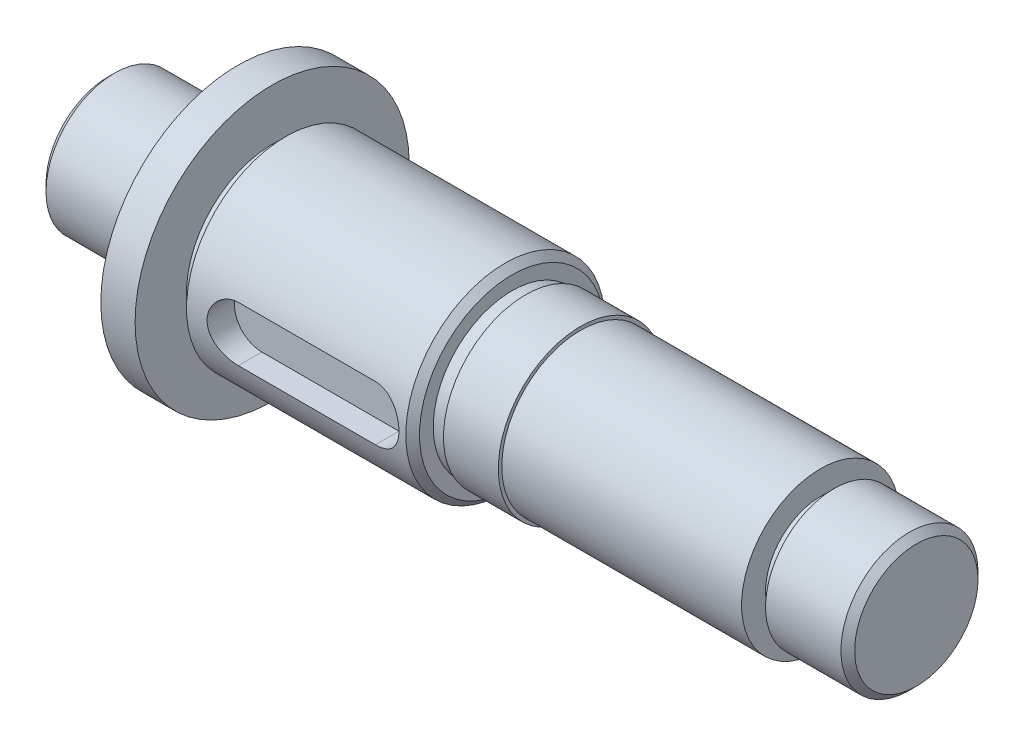
ISO-10303-21;
HEADER;
FILE_DESCRIPTION(('STEP AP214'),'2;1');
FILE_NAME('part.step','',(''),(''),'','','');
FILE_SCHEMA(('AUTOMOTIVE_DESIGN { 1 0 10303 214 1 1 1 1 }'));
ENDSEC;
DATA;
#1=APPLICATION_CONTEXT('core data for automotive mechanical design processes');
#2=APPLICATION_PROTOCOL_DEFINITION('international standard','automotive_design',2000,#1);
#3=PRODUCT_CONTEXT('',#1,'mechanical');
#4=PRODUCT('Part','Part','',(#3));
#5=PRODUCT_RELATED_PRODUCT_CATEGORY('part','',(#4));
#6=PRODUCT_DEFINITION_FORMATION('','',#4);
#7=PRODUCT_DEFINITION_CONTEXT('part definition',#1,'design');
#8=PRODUCT_DEFINITION('design','',#6,#7);
#9=PRODUCT_DEFINITION_SHAPE('','',#8);
#10=(LENGTH_UNIT() NAMED_UNIT(*) SI_UNIT(.MILLI.,.METRE.));
#11=(NAMED_UNIT(*) PLANE_ANGLE_UNIT() SI_UNIT($,.RADIAN.));
#12=(NAMED_UNIT(*) SI_UNIT($,.STERADIAN.) SOLID_ANGLE_UNIT());
#13=UNCERTAINTY_MEASURE_WITH_UNIT(LENGTH_MEASURE(1.E-05),#10,'distance_accuracy_value','');
#14=(GEOMETRIC_REPRESENTATION_CONTEXT(3) GLOBAL_UNCERTAINTY_ASSIGNED_CONTEXT((#13)) GLOBAL_UNIT_ASSIGNED_CONTEXT((#10,
#11,#12)) REPRESENTATION_CONTEXT('',''));
#15=CARTESIAN_POINT('',(0.,0.,0.));
#16=DIRECTION('',(0.,0.,1.));
#17=DIRECTION('',(1.,0.,0.));
#18=AXIS2_PLACEMENT_3D('',#15,#16,#17);
#19=CARTESIAN_POINT('',(53.,0.,10.5));
#20=DIRECTION('',(0.,0.,1.));
#21=DIRECTION('',(1.,0.,0.));
#22=AXIS2_PLACEMENT_3D('',#19,#20,#21);
#23=CYLINDRICAL_SURFACE('',#22,4.);
#24=DIRECTION('',(0.,0.,1.));
#25=VECTOR('',#24,1.);
#26=CARTESIAN_POINT('',(53.,4.,16.0159703166851));
#27=LINE('',#26,#25);
#28=CARTESIAN_POINT('',(53.,4.,10.5));
#29=VERTEX_POINT('',#28);
#30=CARTESIAN_POINT('',(53.,4.,13.9373598647664));
#31=VERTEX_POINT('',#30);
#32=EDGE_CURVE('E131',#29,#31,#27,.T.);
#33=ORIENTED_EDGE('',*,*,#32,.F.);
#34=CARTESIAN_POINT('',(53.,0.,10.5));
#35=DIRECTION('',(0.,0.,1.));
#36=DIRECTION('',(0.,-1.,0.));
#37=AXIS2_PLACEMENT_3D('',#34,#35,#36);
#38=CIRCLE('',#37,4.);
#39=CARTESIAN_POINT('',(53.,-4.,10.5));
#40=VERTEX_POINT('',#39);
#41=EDGE_CURVE('E60',#40,#29,#38,.T.);
#42=ORIENTED_EDGE('',*,*,#41,.F.);
#43=DIRECTION('',(0.,0.,1.));
#44=VECTOR('',#43,1.);
#45=CARTESIAN_POINT('',(53.,-4.,16.0159703166851));
#46=LINE('',#45,#44);
#47=CARTESIAN_POINT('',(53.,-4.,13.9373598647664));
#48=VERTEX_POINT('',#47);
#49=EDGE_CURVE('E219',#48,#40,#46,.F.);
#50=ORIENTED_EDGE('',*,*,#49,.F.);
#51=CARTESIAN_POINT('',(53.,4.,13.9373598647664));
#52=CARTESIAN_POINT('',(53.1102059889812,4.00001325597505,13.9373460180887));
#53=CARTESIAN_POINT('',(53.2204037999339,3.99544571732389,13.9386666876932));
#54=CARTESIAN_POINT('',(53.439967070205,3.97725208988071,13.9438742599525));
#55=CARTESIAN_POINT('',(53.5493326883634,3.9636277759644,13.9477606597944));
#56=CARTESIAN_POINT('',(53.7662152014137,3.92746427782443,13.9579854560952));
#57=CARTESIAN_POINT('',(53.8737357011809,3.90494521382944,13.9643183178683));
#58=CARTESIAN_POINT('',(54.0863915782684,3.85120725044205,13.9792336925427));
#59=CARTESIAN_POINT('',(54.1915269083627,3.81998817895384,13.9878162499453));
#60=CARTESIAN_POINT('',(54.5022185966041,3.71364238857044,14.0165732187682));
#61=CARTESIAN_POINT('',(54.7033033443242,3.62578622028878,14.0397692239273));
#62=CARTESIAN_POINT('',(55.087851333906,3.4188675164449,14.0915807913353));
#63=CARTESIAN_POINT('',(55.271308684257,3.29979459670996,14.1201981561053));
#64=CARTESIAN_POINT('',(55.6203542224484,3.03042338314072,14.1804793815263));
#65=CARTESIAN_POINT('',(55.7854091860573,2.8794455170423,14.2121997924082));
#66=CARTESIAN_POINT('',(56.0882395209258,2.55196782385258,14.2746348708143));
#67=CARTESIAN_POINT('',(56.2260051731764,2.37545894254899,14.3053491767783));
#68=CARTESIAN_POINT('',(56.4726258182153,1.99813892892309,14.3629547783072));
#69=CARTESIAN_POINT('',(56.5809281648766,1.79695413956416,14.3897691085963));
#70=CARTESIAN_POINT('',(56.7618561791217,1.37850146881861,14.4358528652023));
#71=CARTESIAN_POINT('',(56.834524899903,1.16125336263864,14.4551313906723));
#72=CARTESIAN_POINT('',(56.9252388794121,0.785794331761582,14.4795126327075));
#73=CARTESIAN_POINT('',(56.9532234214846,0.630077143256065,14.4871547354295));
#74=CARTESIAN_POINT('',(56.9906071668372,0.316260842976793,14.4974005383162));
#75=CARTESIAN_POINT('',(57.0000068285899,0.158161790058475,14.5000043627707));
#76=CARTESIAN_POINT('',(56.9999904960444,-0.220127821949305,14.4999939279442));
#77=CARTESIAN_POINT('',(56.9817599024928,-0.440377170530442,14.4949355982041));
#78=CARTESIAN_POINT('',(56.9094298289169,-0.874584716046782,14.4752365702804));
#79=CARTESIAN_POINT('',(56.8552972042053,-1.08853690866165,14.4605870176584));
#80=CARTESIAN_POINT('',(56.7130749298556,-1.50370987224598,14.4233229787093));
#81=CARTESIAN_POINT('',(56.6250378143884,-1.70494978180705,14.4007208194068));
#82=CARTESIAN_POINT('',(56.4176847404685,-2.08979118638068,14.3499303208281));
#83=CARTESIAN_POINT('',(56.2983685563995,-2.27339255415313,14.3217419412589));
#84=CARTESIAN_POINT('',(56.0287350804414,-2.62229768904833,14.2620337662801));
#85=CARTESIAN_POINT('',(55.8777883074313,-2.78710470127047,14.2304539009196));
#86=CARTESIAN_POINT('',(55.5505086479565,-3.08942422034707,14.1678983024214));
#87=CARTESIAN_POINT('',(55.3741710070338,-3.22693160382985,14.1369226836656));
#88=CARTESIAN_POINT('',(54.9970649784101,-3.47324105712207,14.0784577658062));
#89=CARTESIAN_POINT('',(54.7958989209249,-3.58145354016938,14.0510451396435));
#90=CARTESIAN_POINT('',(54.3774005946016,-3.76226284327311,14.0037196889098));
#91=CARTESIAN_POINT('',(54.1600816873105,-3.83488873093891,13.9838007464961));
#92=CARTESIAN_POINT('',(53.7847047976568,-3.92544593738417,13.9585949825791));
#93=CARTESIAN_POINT('',(53.6291580822033,-3.9533529437201,13.9506864803077));
#94=CARTESIAN_POINT('',(53.3157708550867,-3.99064537161469,13.9400447946199));
#95=CARTESIAN_POINT('',(53.1579315628134,-4.00004030049732,13.9373089546872));
#96=CARTESIAN_POINT('',(53.,-4.,13.9373598647664));
#97=B_SPLINE_CURVE_WITH_KNOTS('',3,(#51,#52,#53,#54,#55,#56,#57,#58,#59,#60,#61,#62,#63,#64,#65,
#66,#67,#68,#69,#70,#71,#72,#73,#74,#75,#76,#77,#78,#79,#80,#81,#82,#83,#84,#85,#86,#87,#88,#89,
#90,#91,#92,#93,#94,#95,#96),.UNSPECIFIED.,.F.,.F.,(4,2,2,2,2,2,2,2,2,2,2,2,2,2,2,2,2,2,2,2,2,2,
4),(0.,0.330501430450789,0.660938110912353,0.990631573990008,1.32033155923313,1.97900157430981,
2.63789097291195,3.31256142006887,3.98747171882915,4.67428331049733,5.36026302658158,
5.83433741392871,6.30840010613461,6.96819529345124,7.62860045190982,8.28798641942183,
8.94737714322495,9.62140788843933,10.2955650109176,10.9824226768753,11.6687183691304,
12.1422823421898,12.6156030415901),.UNSPECIFIED.);
#98=EDGE_CURVE('E11',#48,#31,#97,.F.);
#99=ORIENTED_EDGE('',*,*,#98,.T.);
#100=EDGE_LOOP('',(#33,#42,#50,#99));
#101=FACE_BOUND('',#100,.T.);
#102=ADVANCED_FACE('F45',(#101),#23,.F.);
#103=CARTESIAN_POINT('',(33.,0.,13.9373598647664));
#104=DIRECTION('',(0.,0.,1.));
#105=DIRECTION('',(1.,0.,0.));
#106=AXIS2_PLACEMENT_3D('',#103,#104,#105);
#107=CYLINDRICAL_SURFACE('',#106,4.);
#108=DIRECTION('',(0.,0.,-1.));
#109=VECTOR('',#108,1.);
#110=CARTESIAN_POINT('',(33.,4.,13.9373598647664));
#111=LINE('',#110,#109);
#112=CARTESIAN_POINT('',(33.,4.,13.9373598647664));
#113=VERTEX_POINT('',#112);
#114=CARTESIAN_POINT('',(33.,4.,10.5));
#115=VERTEX_POINT('',#114);
#116=EDGE_CURVE('E107',#113,#115,#111,.T.);
#117=ORIENTED_EDGE('',*,*,#116,.F.);
#118=CARTESIAN_POINT('',(33.,-4.,13.9373598647664));
#119=CARTESIAN_POINT('',(32.8897940110188,-4.00001325597504,13.9373460180887));
#120=CARTESIAN_POINT('',(32.7795962000661,-3.99544571732389,13.9386666876932));
#121=CARTESIAN_POINT('',(32.560032929795,-3.9772520898807,13.9438742599525));
#122=CARTESIAN_POINT('',(32.4506673116366,-3.96362777596439,13.9477606597944));
#123=CARTESIAN_POINT('',(32.2337847985863,-3.92746427782442,13.9579854560952));
#124=CARTESIAN_POINT('',(32.1262642988191,-3.90494521382944,13.9643183178683));
#125=CARTESIAN_POINT('',(31.9136084217317,-3.85120725044204,13.9792336925427));
#126=CARTESIAN_POINT('',(31.8084730916373,-3.81998817895383,13.9878162499453));
#127=CARTESIAN_POINT('',(31.4977814033959,-3.71364238857044,14.0165732187683));
#128=CARTESIAN_POINT('',(31.2966966556758,-3.62578622028877,14.0397692239273));
#129=CARTESIAN_POINT('',(30.912148666094,-3.41886751644489,14.0915807913353));
#130=CARTESIAN_POINT('',(30.728691315743,-3.29979459670995,14.1201981561053));
#131=CARTESIAN_POINT('',(30.3796457775516,-3.03042338314071,14.1804793815263));
#132=CARTESIAN_POINT('',(30.2145908139427,-2.87944551704229,14.2121997924082));
#133=CARTESIAN_POINT('',(29.9117604790742,-2.55196782385257,14.2746348708143));
#134=CARTESIAN_POINT('',(29.7739948268236,-2.37545894254898,14.3053491767783));
#135=CARTESIAN_POINT('',(29.5273741817847,-1.99813892892308,14.3629547783072));
#136=CARTESIAN_POINT('',(29.4190718351234,-1.79695413956414,14.3897691085963));
#137=CARTESIAN_POINT('',(29.2381438208783,-1.37850146881859,14.4358528652023));
#138=CARTESIAN_POINT('',(29.165475100097,-1.16125336263863,14.4551313906723));
#139=CARTESIAN_POINT('',(29.0747611205883,-0.785794331762929,14.4795126327075));
#140=CARTESIAN_POINT('',(29.0467765785159,-0.630077143258808,14.4871547354294));
#141=CARTESIAN_POINT('',(29.0093928331633,-0.316260842982348,14.4974005383161));
#142=CARTESIAN_POINT('',(28.9999931714104,-0.158161790065447,14.5000043627706));
#143=CARTESIAN_POINT('',(29.0000095039551,0.220127821940898,14.4999939279443));
#144=CARTESIAN_POINT('',(29.0182400975063,0.440377170522038,14.4949355982044));
#145=CARTESIAN_POINT('',(29.0905701710812,0.874584716038472,14.4752365702809));
#146=CARTESIAN_POINT('',(29.1447027957924,1.08853690865343,14.460587017659));
#147=CARTESIAN_POINT('',(29.2869250701412,1.50370987223801,14.4233229787102));
#148=CARTESIAN_POINT('',(29.3749621856079,1.70494978179925,14.4007208194077));
#149=CARTESIAN_POINT('',(29.5823152595269,2.08979118637329,14.3499303208292));
#150=CARTESIAN_POINT('',(29.7016314435956,2.27339255414597,14.32174194126));
#151=CARTESIAN_POINT('',(29.9712649195528,2.62229768904169,14.2620337662814));
#152=CARTESIAN_POINT('',(30.1222116925626,2.78710470126414,14.2304539009208));
#153=CARTESIAN_POINT('',(30.4494913520367,3.08942422034139,14.1678983024226));
#154=CARTESIAN_POINT('',(30.6258289929589,3.22693160382453,14.1369226836669));
#155=CARTESIAN_POINT('',(31.002935021582,3.47324105711757,14.0784577658073));
#156=CARTESIAN_POINT('',(31.204101079067,3.58145354016532,14.0510451396446));
#157=CARTESIAN_POINT('',(31.6225994053899,3.76226284327,14.0037196889106));
#158=CARTESIAN_POINT('',(31.8399183126809,3.83488873093629,13.9838007464969));
#159=CARTESIAN_POINT('',(32.2152952023358,3.92544593738276,13.9585949825795));
#160=CARTESIAN_POINT('',(32.3708419177907,3.95335294371922,13.950686480308));
#161=CARTESIAN_POINT('',(32.6842291449103,3.99064537161452,13.9400447946199));
#162=CARTESIAN_POINT('',(32.8420684371851,4.00004030049733,13.9373089546872));
#163=CARTESIAN_POINT('',(33.,4.,13.9373598647664));
#164=B_SPLINE_CURVE_WITH_KNOTS('',3,(#118,#119,#120,#121,#122,#123,#124,#125,#126,#127,#128,
#129,#130,#131,#132,#133,#134,#135,#136,#137,#138,#139,#140,#141,#142,#143,#144,#145,#146,#147,
#148,#149,#150,#151,#152,#153,#154,#155,#156,#157,#158,#159,#160,#161,#162,#163),.UNSPECIFIED.,
.F.,.F.,(4,2,2,2,2,2,2,2,2,2,2,2,2,2,2,2,2,2,2,2,2,2,4),(0.,0.330501430450795,0.660938110912353,
0.990631573990015,1.32033155923313,1.97900157430981,2.63789097291195,3.31256142006887,
3.98747171882916,4.67428331049734,5.36026302658158,5.83433741392454,6.30840010612625,
6.96819529344276,7.62860045190124,8.28798641941315,8.94737714321616,9.62140788843039,
10.2955650109085,10.9824226768663,11.6687183691214,12.1422823421852,12.6156030415902),.UNSPECIFIED.);
#165=CARTESIAN_POINT('',(33.,-4.,13.9373598647664));
#166=VERTEX_POINT('',#165);
#167=EDGE_CURVE('E112',#113,#166,#164,.F.);
#168=ORIENTED_EDGE('',*,*,#167,.T.);
#169=DIRECTION('',(0.,0.,-1.));
#170=VECTOR('',#169,1.);
#171=CARTESIAN_POINT('',(33.,-4.,13.9373598647664));
#172=LINE('',#171,#170);
#173=CARTESIAN_POINT('',(33.,-4.,10.5));
#174=VERTEX_POINT('',#173);
#175=EDGE_CURVE('E110',#174,#166,#172,.F.);
#176=ORIENTED_EDGE('',*,*,#175,.F.);
#177=CARTESIAN_POINT('',(33.,0.,10.5));
#178=DIRECTION('',(0.,0.,1.));
#179=DIRECTION('',(0.,-1.,0.));
#180=AXIS2_PLACEMENT_3D('',#177,#178,#179);
#181=CIRCLE('',#180,4.);
#182=EDGE_CURVE('E94',#115,#174,#181,.T.);
#183=ORIENTED_EDGE('',*,*,#182,.F.);
#184=EDGE_LOOP('',(#117,#168,#176,#183));
#185=FACE_BOUND('',#184,.T.);
#186=ADVANCED_FACE('F105',(#185),#107,.F.);
#187=CARTESIAN_POINT('',(0.,0.,0.));
#188=DIRECTION('',(-1.,0.,0.));
#189=DIRECTION('',(0.,0.,1.));
#190=AXIS2_PLACEMENT_3D('',#187,#188,#189);
#191=PLANE('',#190);
#192=CARTESIAN_POINT('',(0.,0.,0.));
#193=DIRECTION('',(-1.,0.,0.));
#194=DIRECTION('',(0.,0.,1.));
#195=AXIS2_PLACEMENT_3D('',#192,#193,#194);
#196=CIRCLE('',#195,8.99999999999999);
#197=CARTESIAN_POINT('',(0.,0.,8.99999999999999));
#198=VERTEX_POINT('',#197);
#199=EDGE_CURVE('E323',#198,#198,#196,.T.);
#200=ORIENTED_EDGE('',*,*,#199,.T.);
#201=EDGE_LOOP('',(#200));
#202=FACE_BOUND('',#201,.T.);
#203=ADVANCED_FACE('F183',(#202),#191,.T.);
#204=CARTESIAN_POINT('',(0.,0.,0.));
#205=DIRECTION('',(1.,0.,0.));
#206=DIRECTION('',(0.,0.,-1.));
#207=AXIS2_PLACEMENT_3D('',#204,#205,#206);
#208=CYLINDRICAL_SURFACE('',#207,10.);
#209=CARTESIAN_POINT('',(1.,0.,0.));
#210=DIRECTION('',(-1.,0.,0.));
#211=DIRECTION('',(0.,0.,1.));
#212=AXIS2_PLACEMENT_3D('',#209,#210,#211);
#213=CIRCLE('',#212,10.);
#214=CARTESIAN_POINT('',(1.,0.,10.));
#215=VERTEX_POINT('',#214);
#216=EDGE_CURVE('E319',#215,#215,#213,.F.);
#217=ORIENTED_EDGE('',*,*,#216,.T.);
#218=EDGE_LOOP('',(#217));
#219=FACE_BOUND('',#218,.T.);
#220=CARTESIAN_POINT('',(12.,0.,0.));
#221=DIRECTION('',(1.,0.,0.));
#222=DIRECTION('',(0.,0.,-1.));
#223=AXIS2_PLACEMENT_3D('',#220,#221,#222);
#224=CIRCLE('',#223,10.);
#225=CARTESIAN_POINT('',(12.,0.,-10.));
#226=VERTEX_POINT('',#225);
#227=EDGE_CURVE('E299',#226,#226,#224,.T.);
#228=ORIENTED_EDGE('',*,*,#227,.F.);
#229=EDGE_LOOP('',(#228));
#230=FACE_BOUND('',#229,.T.);
#231=ADVANCED_FACE('F179',(#219,#230),#208,.T.);
#232=CARTESIAN_POINT('',(12.,10.,0.));
#233=DIRECTION('',(1.,0.,0.));
#234=DIRECTION('',(0.,0.,-1.));
#235=AXIS2_PLACEMENT_3D('',#232,#233,#234);
#236=PLANE('',#235);
#237=ORIENTED_EDGE('',*,*,#227,.T.);
#238=EDGE_LOOP('',(#237));
#239=FACE_BOUND('',#238,.T.);
#240=CARTESIAN_POINT('',(12.,0.,0.));
#241=DIRECTION('',(1.,0.,0.));
#242=DIRECTION('',(0.,0.,-1.));
#243=AXIS2_PLACEMENT_3D('',#240,#241,#242);
#244=CIRCLE('',#243,8.);
#245=CARTESIAN_POINT('',(12.,0.,-8.));
#246=VERTEX_POINT('',#245);
#247=EDGE_CURVE('E295',#246,#246,#244,.T.);
#248=ORIENTED_EDGE('',*,*,#247,.F.);
#249=EDGE_LOOP('',(#248));
#250=FACE_BOUND('',#249,.T.);
#251=ADVANCED_FACE('F175',(#239,#250),#236,.T.);
#252=CARTESIAN_POINT('',(0.,0.,0.));
#253=DIRECTION('',(1.,0.,0.));
#254=DIRECTION('',(0.,0.,-1.));
#255=AXIS2_PLACEMENT_3D('',#252,#253,#254);
#256=CYLINDRICAL_SURFACE('',#255,8.);
#257=ORIENTED_EDGE('',*,*,#247,.T.);
#258=EDGE_LOOP('',(#257));
#259=FACE_BOUND('',#258,.T.);
#260=CARTESIAN_POINT('',(14.,0.,0.));
#261=DIRECTION('',(1.,0.,0.));
#262=DIRECTION('',(0.,0.,-1.));
#263=AXIS2_PLACEMENT_3D('',#260,#261,#262);
#264=CIRCLE('',#263,8.);
#265=CARTESIAN_POINT('',(14.,0.,-8.));
#266=VERTEX_POINT('',#265);
#267=EDGE_CURVE('E291',#266,#266,#264,.T.);
#268=ORIENTED_EDGE('',*,*,#267,.F.);
#269=EDGE_LOOP('',(#268));
#270=FACE_BOUND('',#269,.T.);
#271=ADVANCED_FACE('F171',(#259,#270),#256,.T.);
#272=CARTESIAN_POINT('',(14.,8.,0.));
#273=DIRECTION('',(-1.,0.,0.));
#274=DIRECTION('',(0.,0.,1.));
#275=AXIS2_PLACEMENT_3D('',#272,#273,#274);
#276=PLANE('',#275);
#277=ORIENTED_EDGE('',*,*,#267,.T.);
#278=EDGE_LOOP('',(#277));
#279=FACE_BOUND('',#278,.T.);
#280=CARTESIAN_POINT('',(14.,0.,0.));
#281=DIRECTION('',(1.,0.,0.));
#282=DIRECTION('',(0.,0.,-1.));
#283=AXIS2_PLACEMENT_3D('',#280,#281,#282);
#284=CIRCLE('',#283,12.5);
#285=CARTESIAN_POINT('',(14.,0.,-12.5));
#286=VERTEX_POINT('',#285);
#287=EDGE_CURVE('E287',#286,#286,#284,.T.);
#288=ORIENTED_EDGE('',*,*,#287,.F.);
#289=EDGE_LOOP('',(#288));
#290=FACE_BOUND('',#289,.T.);
#291=ADVANCED_FACE('F167',(#279,#290),#276,.T.);
#292=CARTESIAN_POINT('',(0.,0.,0.));
#293=DIRECTION('',(1.,0.,0.));
#294=DIRECTION('',(0.,0.,-1.));
#295=AXIS2_PLACEMENT_3D('',#292,#293,#294);
#296=CYLINDRICAL_SURFACE('',#295,12.5);
#297=ORIENTED_EDGE('',*,*,#287,.T.);
#298=EDGE_LOOP('',(#297));
#299=FACE_BOUND('',#298,.T.);
#300=CARTESIAN_POINT('',(19.,0.,0.));
#301=DIRECTION('',(1.,0.,0.));
#302=DIRECTION('',(0.,0.,-1.));
#303=AXIS2_PLACEMENT_3D('',#300,#301,#302);
#304=CIRCLE('',#303,12.5);
#305=CARTESIAN_POINT('',(19.,0.,-12.5));
#306=VERTEX_POINT('',#305);
#307=EDGE_CURVE('E283',#306,#306,#304,.T.);
#308=ORIENTED_EDGE('',*,*,#307,.F.);
#309=EDGE_LOOP('',(#308));
#310=FACE_BOUND('',#309,.T.);
#311=ADVANCED_FACE('F163',(#299,#310),#296,.T.);
#312=CARTESIAN_POINT('',(19.,12.5,0.));
#313=DIRECTION('',(-1.,0.,0.));
#314=DIRECTION('',(0.,0.,1.));
#315=AXIS2_PLACEMENT_3D('',#312,#313,#314);
#316=PLANE('',#315);
#317=ORIENTED_EDGE('',*,*,#307,.T.);
#318=EDGE_LOOP('',(#317));
#319=FACE_BOUND('',#318,.T.);
#320=CARTESIAN_POINT('',(19.,0.,0.));
#321=DIRECTION('',(1.,0.,0.));
#322=DIRECTION('',(0.,0.,-1.));
#323=AXIS2_PLACEMENT_3D('',#320,#321,#322);
#324=CIRCLE('',#323,20.);
#325=CARTESIAN_POINT('',(19.,0.,-20.));
#326=VERTEX_POINT('',#325);
#327=EDGE_CURVE('E279',#326,#326,#324,.T.);
#328=ORIENTED_EDGE('',*,*,#327,.F.);
#329=EDGE_LOOP('',(#328));
#330=FACE_BOUND('',#329,.T.);
#331=ADVANCED_FACE('F159',(#319,#330),#316,.T.);
#332=CARTESIAN_POINT('',(0.,0.,0.));
#333=DIRECTION('',(1.,0.,0.));
#334=DIRECTION('',(0.,0.,-1.));
#335=AXIS2_PLACEMENT_3D('',#332,#333,#334);
#336=CYLINDRICAL_SURFACE('',#335,20.);
#337=ORIENTED_EDGE('',*,*,#327,.T.);
#338=EDGE_LOOP('',(#337));
#339=FACE_BOUND('',#338,.T.);
#340=CARTESIAN_POINT('',(24.,0.,0.));
#341=DIRECTION('',(1.,0.,0.));
#342=DIRECTION('',(0.,0.,-1.));
#343=AXIS2_PLACEMENT_3D('',#340,#341,#342);
#344=CIRCLE('',#343,20.);
#345=CARTESIAN_POINT('',(24.,0.,-20.));
#346=VERTEX_POINT('',#345);
#347=EDGE_CURVE('E275',#346,#346,#344,.T.);
#348=ORIENTED_EDGE('',*,*,#347,.F.);
#349=EDGE_LOOP('',(#348));
#350=FACE_BOUND('',#349,.T.);
#351=ADVANCED_FACE('F155',(#339,#350),#336,.T.);
#352=CARTESIAN_POINT('',(24.,20.,0.));
#353=DIRECTION('',(1.,0.,0.));
#354=DIRECTION('',(0.,0.,-1.));
#355=AXIS2_PLACEMENT_3D('',#352,#353,#354);
#356=PLANE('',#355);
#357=ORIENTED_EDGE('',*,*,#347,.T.);
#358=EDGE_LOOP('',(#357));
#359=FACE_BOUND('',#358,.T.);
#360=CARTESIAN_POINT('',(24.,0.,0.));
#361=DIRECTION('',(1.,0.,0.));
#362=DIRECTION('',(0.,0.,-1.));
#363=AXIS2_PLACEMENT_3D('',#360,#361,#362);
#364=CIRCLE('',#363,12.5);
#365=CARTESIAN_POINT('',(24.,0.,-12.5));
#366=VERTEX_POINT('',#365);
#367=EDGE_CURVE('E271',#366,#366,#364,.T.);
#368=ORIENTED_EDGE('',*,*,#367,.F.);
#369=EDGE_LOOP('',(#368));
#370=FACE_BOUND('',#369,.T.);
#371=ADVANCED_FACE('F151',(#359,#370),#356,.T.);
#372=CARTESIAN_POINT('',(0.,0.,0.));
#373=DIRECTION('',(1.,0.,0.));
#374=DIRECTION('',(0.,0.,-1.));
#375=AXIS2_PLACEMENT_3D('',#372,#373,#374);
#376=CYLINDRICAL_SURFACE('',#375,12.5);
#377=ORIENTED_EDGE('',*,*,#367,.T.);
#378=EDGE_LOOP('',(#377));
#379=FACE_BOUND('',#378,.T.);
#380=CARTESIAN_POINT('',(26.,0.,0.));
#381=DIRECTION('',(1.,0.,0.));
#382=DIRECTION('',(0.,0.,-1.));
#383=AXIS2_PLACEMENT_3D('',#380,#381,#382);
#384=CIRCLE('',#383,12.5);
#385=CARTESIAN_POINT('',(26.,0.,-12.5));
#386=VERTEX_POINT('',#385);
#387=EDGE_CURVE('E267',#386,#386,#384,.T.);
#388=ORIENTED_EDGE('',*,*,#387,.F.);
#389=EDGE_LOOP('',(#388));
#390=FACE_BOUND('',#389,.T.);
#391=ADVANCED_FACE('F147',(#379,#390),#376,.T.);
#392=CARTESIAN_POINT('',(26.,12.5,0.));
#393=DIRECTION('',(-1.,0.,0.));
#394=DIRECTION('',(0.,0.,1.));
#395=AXIS2_PLACEMENT_3D('',#392,#393,#394);
#396=PLANE('',#395);
#397=ORIENTED_EDGE('',*,*,#387,.T.);
#398=EDGE_LOOP('',(#397));
#399=FACE_BOUND('',#398,.T.);
#400=CARTESIAN_POINT('',(26.,0.,0.));
#401=DIRECTION('',(1.,0.,0.));
#402=DIRECTION('',(0.,0.,-1.));
#403=AXIS2_PLACEMENT_3D('',#400,#401,#402);
#404=CIRCLE('',#403,14.5);
#405=CARTESIAN_POINT('',(26.,0.,-14.5));
#406=VERTEX_POINT('',#405);
#407=EDGE_CURVE('E263',#406,#406,#404,.T.);
#408=ORIENTED_EDGE('',*,*,#407,.F.);
#409=EDGE_LOOP('',(#408));
#410=FACE_BOUND('',#409,.T.);
#411=ADVANCED_FACE('F142',(#399,#410),#396,.T.);
#412=CARTESIAN_POINT('',(0.,0.,0.));
#413=DIRECTION('',(1.,0.,0.));
#414=DIRECTION('',(0.,0.,-1.));
#415=AXIS2_PLACEMENT_3D('',#412,#413,#414);
#416=CYLINDRICAL_SURFACE('',#415,14.5);
#417=ORIENTED_EDGE('',*,*,#98,.F.);
#418=DIRECTION('',(1.,0.,0.));
#419=VECTOR('',#418,1.);
#420=CARTESIAN_POINT('',(0.,-4.,13.9373598647664));
#421=LINE('',#420,#419);
#422=EDGE_CURVE('E121',#48,#166,#421,.F.);
#423=ORIENTED_EDGE('',*,*,#422,.T.);
#424=ORIENTED_EDGE('',*,*,#167,.F.);
#425=DIRECTION('',(1.,0.,0.));
#426=VECTOR('',#425,1.);
#427=CARTESIAN_POINT('',(0.,4.,13.9373598647664));
#428=LINE('',#427,#426);
#429=EDGE_CURVE('E115',#113,#31,#428,.T.);
#430=ORIENTED_EDGE('',*,*,#429,.T.);
#431=EDGE_LOOP('',(#417,#423,#424,#430));
#432=FACE_BOUND('',#431,.T.);
#433=CARTESIAN_POINT('',(58.,0.,0.));
#434=DIRECTION('',(1.,0.,0.));
#435=DIRECTION('',(0.,0.,-1.));
#436=AXIS2_PLACEMENT_3D('',#433,#434,#435);
#437=CIRCLE('',#436,14.5);
#438=CARTESIAN_POINT('',(58.,0.,-14.5));
#439=VERTEX_POINT('',#438);
#440=EDGE_CURVE('E307',#439,#439,#437,.F.);
#441=ORIENTED_EDGE('',*,*,#440,.T.);
#442=EDGE_LOOP('',(#441));
#443=FACE_BOUND('',#442,.T.);
#444=ORIENTED_EDGE('',*,*,#407,.T.);
#445=EDGE_LOOP('',(#444));
#446=FACE_BOUND('',#445,.T.);
#447=ADVANCED_FACE('F136',(#432,#443,#446),#416,.T.);
#448=CARTESIAN_POINT('',(59.,14.5,0.));
#449=DIRECTION('',(1.,0.,0.));
#450=DIRECTION('',(0.,0.,-1.));
#451=AXIS2_PLACEMENT_3D('',#448,#449,#450);
#452=PLANE('',#451);
#453=CARTESIAN_POINT('',(59.,0.,0.));
#454=DIRECTION('',(1.,0.,0.));
#455=DIRECTION('',(0.,0.,-1.));
#456=AXIS2_PLACEMENT_3D('',#453,#454,#455);
#457=CIRCLE('',#456,13.5);
#458=CARTESIAN_POINT('',(59.,0.,-13.5));
#459=VERTEX_POINT('',#458);
#460=EDGE_CURVE('E303',#459,#459,#457,.T.);
#461=ORIENTED_EDGE('',*,*,#460,.T.);
#462=EDGE_LOOP('',(#461));
#463=FACE_BOUND('',#462,.T.);
#464=CARTESIAN_POINT('',(59.,0.,0.));
#465=DIRECTION('',(1.,0.,0.));
#466=DIRECTION('',(0.,0.,-1.));
#467=AXIS2_PLACEMENT_3D('',#464,#465,#466);
#468=CIRCLE('',#467,11.5);
#469=CARTESIAN_POINT('',(59.,0.,-11.5));
#470=VERTEX_POINT('',#469);
#471=EDGE_CURVE('E259',#470,#470,#468,.T.);
#472=ORIENTED_EDGE('',*,*,#471,.F.);
#473=EDGE_LOOP('',(#472));
#474=FACE_BOUND('',#473,.T.);
#475=ADVANCED_FACE('F141',(#463,#474),#452,.T.);
#476=CARTESIAN_POINT('',(0.,0.,0.));
#477=DIRECTION('',(1.,0.,0.));
#478=DIRECTION('',(0.,0.,-1.));
#479=AXIS2_PLACEMENT_3D('',#476,#477,#478);
#480=CYLINDRICAL_SURFACE('',#479,11.5);
#481=ORIENTED_EDGE('',*,*,#471,.T.);
#482=EDGE_LOOP('',(#481));
#483=FACE_BOUND('',#482,.T.);
#484=CARTESIAN_POINT('',(61.,0.,0.));
#485=DIRECTION('',(1.,0.,0.));
#486=DIRECTION('',(0.,0.,-1.));
#487=AXIS2_PLACEMENT_3D('',#484,#485,#486);
#488=CIRCLE('',#487,11.5);
#489=CARTESIAN_POINT('',(61.,0.,-11.5));
#490=VERTEX_POINT('',#489);
#491=EDGE_CURVE('E255',#490,#490,#488,.T.);
#492=ORIENTED_EDGE('',*,*,#491,.F.);
#493=EDGE_LOOP('',(#492));
#494=FACE_BOUND('',#493,.T.);
#495=ADVANCED_FACE('F337',(#483,#494),#480,.T.);
#496=CARTESIAN_POINT('',(61.,11.5,0.));
#497=DIRECTION('',(-1.,0.,0.));
#498=DIRECTION('',(0.,0.,1.));
#499=AXIS2_PLACEMENT_3D('',#496,#497,#498);
#500=PLANE('',#499);
#501=ORIENTED_EDGE('',*,*,#491,.T.);
#502=EDGE_LOOP('',(#501));
#503=FACE_BOUND('',#502,.T.);
#504=CARTESIAN_POINT('',(61.,0.,0.));
#505=DIRECTION('',(1.,0.,0.));
#506=DIRECTION('',(0.,0.,-1.));
#507=AXIS2_PLACEMENT_3D('',#504,#505,#506);
#508=CIRCLE('',#507,12.);
#509=CARTESIAN_POINT('',(61.,0.,-12.));
#510=VERTEX_POINT('',#509);
#511=EDGE_CURVE('E251',#510,#510,#508,.T.);
#512=ORIENTED_EDGE('',*,*,#511,.F.);
#513=EDGE_LOOP('',(#512));
#514=FACE_BOUND('',#513,.T.);
#515=ADVANCED_FACE('F342',(#503,#514),#500,.T.);
#516=CARTESIAN_POINT('',(0.,0.,0.));
#517=DIRECTION('',(1.,0.,0.));
#518=DIRECTION('',(0.,0.,-1.));
#519=AXIS2_PLACEMENT_3D('',#516,#517,#518);
#520=CYLINDRICAL_SURFACE('',#519,12.);
#521=ORIENTED_EDGE('',*,*,#511,.T.);
#522=EDGE_LOOP('',(#521));
#523=FACE_BOUND('',#522,.T.);
#524=CARTESIAN_POINT('',(69.,0.,0.));
#525=DIRECTION('',(1.,0.,0.));
#526=DIRECTION('',(0.,0.,-1.));
#527=AXIS2_PLACEMENT_3D('',#524,#525,#526);
#528=CIRCLE('',#527,12.);
#529=CARTESIAN_POINT('',(69.,0.,-12.));
#530=VERTEX_POINT('',#529);
#531=EDGE_CURVE('E247',#530,#530,#528,.T.);
#532=ORIENTED_EDGE('',*,*,#531,.F.);
#533=EDGE_LOOP('',(#532));
#534=FACE_BOUND('',#533,.T.);
#535=ADVANCED_FACE('F347',(#523,#534),#520,.T.);
#536=CARTESIAN_POINT('',(69.,12.,0.));
#537=DIRECTION('',(1.,0.,0.));
#538=DIRECTION('',(0.,0.,-1.));
#539=AXIS2_PLACEMENT_3D('',#536,#537,#538);
#540=PLANE('',#539);
#541=ORIENTED_EDGE('',*,*,#531,.T.);
#542=EDGE_LOOP('',(#541));
#543=FACE_BOUND('',#542,.T.);
#544=CARTESIAN_POINT('',(69.,0.,0.));
#545=DIRECTION('',(1.,0.,0.));
#546=DIRECTION('',(0.,0.,-1.));
#547=AXIS2_PLACEMENT_3D('',#544,#545,#546);
#548=CIRCLE('',#547,11.5);
#549=CARTESIAN_POINT('',(69.,0.,-11.5));
#550=VERTEX_POINT('',#549);
#551=EDGE_CURVE('E243',#550,#550,#548,.T.);
#552=ORIENTED_EDGE('',*,*,#551,.F.);
#553=EDGE_LOOP('',(#552));
#554=FACE_BOUND('',#553,.T.);
#555=ADVANCED_FACE('F353',(#543,#554),#540,.T.);
#556=CARTESIAN_POINT('',(0.,0.,0.));
#557=DIRECTION('',(1.,0.,0.));
#558=DIRECTION('',(0.,0.,-1.));
#559=AXIS2_PLACEMENT_3D('',#556,#557,#558);
#560=CYLINDRICAL_SURFACE('',#559,11.5);
#561=ORIENTED_EDGE('',*,*,#551,.T.);
#562=EDGE_LOOP('',(#561));
#563=FACE_BOUND('',#562,.T.);
#564=CARTESIAN_POINT('',(104.,0.,0.));
#565=DIRECTION('',(1.,0.,0.));
#566=DIRECTION('',(0.,0.,-1.));
#567=AXIS2_PLACEMENT_3D('',#564,#565,#566);
#568=CIRCLE('',#567,11.5);
#569=CARTESIAN_POINT('',(104.,0.,-11.5));
#570=VERTEX_POINT('',#569);
#571=EDGE_CURVE('E239',#570,#570,#568,.T.);
#572=ORIENTED_EDGE('',*,*,#571,.F.);
#573=EDGE_LOOP('',(#572));
#574=FACE_BOUND('',#573,.T.);
#575=ADVANCED_FACE('F359',(#563,#574),#560,.T.);
#576=CARTESIAN_POINT('',(104.,11.5,0.));
#577=DIRECTION('',(1.,0.,0.));
#578=DIRECTION('',(0.,0.,-1.));
#579=AXIS2_PLACEMENT_3D('',#576,#577,#578);
#580=PLANE('',#579);
#581=ORIENTED_EDGE('',*,*,#571,.T.);
#582=EDGE_LOOP('',(#581));
#583=FACE_BOUND('',#582,.T.);
#584=CARTESIAN_POINT('',(104.,0.,0.));
#585=DIRECTION('',(1.,0.,0.));
#586=DIRECTION('',(0.,0.,-1.));
#587=AXIS2_PLACEMENT_3D('',#584,#585,#586);
#588=CIRCLE('',#587,8.);
#589=CARTESIAN_POINT('',(104.,0.,-8.));
#590=VERTEX_POINT('',#589);
#591=EDGE_CURVE('E235',#590,#590,#588,.T.);
#592=ORIENTED_EDGE('',*,*,#591,.F.);
#593=EDGE_LOOP('',(#592));
#594=FACE_BOUND('',#593,.T.);
#595=ADVANCED_FACE('F365',(#583,#594),#580,.T.);
#596=CARTESIAN_POINT('',(0.,0.,0.));
#597=DIRECTION('',(1.,0.,0.));
#598=DIRECTION('',(0.,0.,-1.));
#599=AXIS2_PLACEMENT_3D('',#596,#597,#598);
#600=CYLINDRICAL_SURFACE('',#599,8.);
#601=ORIENTED_EDGE('',*,*,#591,.T.);
#602=EDGE_LOOP('',(#601));
#603=FACE_BOUND('',#602,.T.);
#604=CARTESIAN_POINT('',(106.,0.,0.));
#605=DIRECTION('',(1.,0.,0.));
#606=DIRECTION('',(0.,0.,-1.));
#607=AXIS2_PLACEMENT_3D('',#604,#605,#606);
#608=CIRCLE('',#607,8.);
#609=CARTESIAN_POINT('',(106.,0.,-8.));
#610=VERTEX_POINT('',#609);
#611=EDGE_CURVE('E231',#610,#610,#608,.T.);
#612=ORIENTED_EDGE('',*,*,#611,.F.);
#613=EDGE_LOOP('',(#612));
#614=FACE_BOUND('',#613,.T.);
#615=ADVANCED_FACE('F371',(#603,#614),#600,.T.);
#616=CARTESIAN_POINT('',(106.,8.,0.));
#617=DIRECTION('',(-1.,0.,0.));
#618=DIRECTION('',(0.,0.,1.));
#619=AXIS2_PLACEMENT_3D('',#616,#617,#618);
#620=PLANE('',#619);
#621=ORIENTED_EDGE('',*,*,#611,.T.);
#622=EDGE_LOOP('',(#621));
#623=FACE_BOUND('',#622,.T.);
#624=CARTESIAN_POINT('',(106.,0.,0.));
#625=DIRECTION('',(1.,0.,0.));
#626=DIRECTION('',(0.,0.,-1.));
#627=AXIS2_PLACEMENT_3D('',#624,#625,#626);
#628=CIRCLE('',#627,10.);
#629=CARTESIAN_POINT('',(106.,0.,-10.));
#630=VERTEX_POINT('',#629);
#631=EDGE_CURVE('E100',#630,#630,#628,.T.);
#632=ORIENTED_EDGE('',*,*,#631,.F.);
#633=EDGE_LOOP('',(#632));
#634=FACE_BOUND('',#633,.T.);
#635=ADVANCED_FACE('F377',(#623,#634),#620,.T.);
#636=CARTESIAN_POINT('',(0.,0.,0.));
#637=DIRECTION('',(1.,0.,0.));
#638=DIRECTION('',(0.,0.,-1.));
#639=AXIS2_PLACEMENT_3D('',#636,#637,#638);
#640=CYLINDRICAL_SURFACE('',#639,10.);
#641=CARTESIAN_POINT('',(117.,0.,0.));
#642=DIRECTION('',(1.,0.,0.));
#643=DIRECTION('',(0.,0.,-1.));
#644=AXIS2_PLACEMENT_3D('',#641,#642,#643);
#645=CIRCLE('',#644,10.);
#646=CARTESIAN_POINT('',(117.,0.,-10.));
#647=VERTEX_POINT('',#646);
#648=EDGE_CURVE('E315',#647,#647,#645,.F.);
#649=ORIENTED_EDGE('',*,*,#648,.T.);
#650=EDGE_LOOP('',(#649));
#651=FACE_BOUND('',#650,.T.);
#652=ORIENTED_EDGE('',*,*,#631,.T.);
#653=EDGE_LOOP('',(#652));
#654=FACE_BOUND('',#653,.T.);
#655=ADVANCED_FACE('F383',(#651,#654),#640,.T.);
#656=CARTESIAN_POINT('',(118.,10.,0.));
#657=DIRECTION('',(1.,0.,0.));
#658=DIRECTION('',(0.,0.,-1.));
#659=AXIS2_PLACEMENT_3D('',#656,#657,#658);
#660=PLANE('',#659);
#661=CARTESIAN_POINT('',(118.,0.,0.));
#662=DIRECTION('',(1.,0.,0.));
#663=DIRECTION('',(0.,0.,-1.));
#664=AXIS2_PLACEMENT_3D('',#661,#662,#663);
#665=CIRCLE('',#664,9.00000000000001);
#666=CARTESIAN_POINT('',(118.,0.,-9.00000000000001));
#667=VERTEX_POINT('',#666);
#668=EDGE_CURVE('E311',#667,#667,#665,.T.);
#669=ORIENTED_EDGE('',*,*,#668,.T.);
#670=EDGE_LOOP('',(#669));
#671=FACE_BOUND('',#670,.T.);
#672=ADVANCED_FACE('F196',(#671),#660,.T.);
#673=CARTESIAN_POINT('',(59.,0.,0.));
#674=DIRECTION('',(-1.,0.,0.));
#675=DIRECTION('',(0.,0.,1.));
#676=AXIS2_PLACEMENT_3D('',#673,#674,#675);
#677=CONICAL_SURFACE('',#676,13.5,0.785398163397447);
#678=ORIENTED_EDGE('',*,*,#440,.F.);
#679=EDGE_LOOP('',(#678));
#680=FACE_BOUND('',#679,.T.);
#681=ORIENTED_EDGE('',*,*,#460,.F.);
#682=EDGE_LOOP('',(#681));
#683=FACE_BOUND('',#682,.T.);
#684=ADVANCED_FACE('F189',(#680,#683),#677,.T.);
#685=CARTESIAN_POINT('',(118.,0.,0.));
#686=DIRECTION('',(-1.,0.,0.));
#687=DIRECTION('',(0.,0.,1.));
#688=AXIS2_PLACEMENT_3D('',#685,#686,#687);
#689=CONICAL_SURFACE('',#688,9.00000000000001,0.785398163397462);
#690=ORIENTED_EDGE('',*,*,#648,.F.);
#691=EDGE_LOOP('',(#690));
#692=FACE_BOUND('',#691,.T.);
#693=ORIENTED_EDGE('',*,*,#668,.F.);
#694=EDGE_LOOP('',(#693));
#695=FACE_BOUND('',#694,.T.);
#696=ADVANCED_FACE('F195',(#692,#695),#689,.T.);
#697=CARTESIAN_POINT('',(1.,0.,0.));
#698=DIRECTION('',(1.,0.,0.));
#699=DIRECTION('',(0.,0.,-1.));
#700=AXIS2_PLACEMENT_3D('',#697,#698,#699);
#701=CONICAL_SURFACE('',#700,10.,0.785398163397452);
#702=ORIENTED_EDGE('',*,*,#199,.F.);
#703=EDGE_LOOP('',(#702));
#704=FACE_BOUND('',#703,.T.);
#705=ORIENTED_EDGE('',*,*,#216,.F.);
#706=EDGE_LOOP('',(#705));
#707=FACE_BOUND('',#706,.T.);
#708=ADVANCED_FACE('F202',(#704,#707),#701,.T.);
#709=CARTESIAN_POINT('',(57.,4.,10.5));
#710=DIRECTION('',(0.,0.,1.));
#711=DIRECTION('',(0.,-1.,0.));
#712=AXIS2_PLACEMENT_3D('',#709,#710,#711);
#713=PLANE('',#712);
#714=DIRECTION('',(-1.,0.,0.));
#715=VECTOR('',#714,1.);
#716=CARTESIAN_POINT('',(57.,-4.,10.5));
#717=LINE('',#716,#715);
#718=EDGE_CURVE('E101',#40,#174,#717,.T.);
#719=ORIENTED_EDGE('',*,*,#718,.F.);
#720=ORIENTED_EDGE('',*,*,#41,.T.);
#721=DIRECTION('',(-1.,0.,0.));
#722=VECTOR('',#721,1.);
#723=CARTESIAN_POINT('',(57.,4.,10.5));
#724=LINE('',#723,#722);
#725=EDGE_CURVE('E90',#29,#115,#724,.T.);
#726=ORIENTED_EDGE('',*,*,#725,.T.);
#727=ORIENTED_EDGE('',*,*,#182,.T.);
#728=EDGE_LOOP('',(#719,#720,#726,#727));
#729=FACE_BOUND('',#728,.T.);
#730=ADVANCED_FACE('F93',(#729),#713,.T.);
#731=CARTESIAN_POINT('',(57.,4.,16.0159703166851));
#732=DIRECTION('',(0.,-1.,0.));
#733=DIRECTION('',(0.,0.,-1.));
#734=AXIS2_PLACEMENT_3D('',#731,#732,#733);
#735=PLANE('',#734);
#736=ORIENTED_EDGE('',*,*,#725,.F.);
#737=ORIENTED_EDGE('',*,*,#32,.T.);
#738=ORIENTED_EDGE('',*,*,#429,.F.);
#739=ORIENTED_EDGE('',*,*,#116,.T.);
#740=EDGE_LOOP('',(#736,#737,#738,#739));
#741=FACE_BOUND('',#740,.T.);
#742=ADVANCED_FACE('F114',(#741),#735,.T.);
#743=CARTESIAN_POINT('',(57.,-4.,16.0159703166851));
#744=DIRECTION('',(0.,1.,0.));
#745=DIRECTION('',(0.,0.,1.));
#746=AXIS2_PLACEMENT_3D('',#743,#744,#745);
#747=PLANE('',#746);
#748=ORIENTED_EDGE('',*,*,#422,.F.);
#749=ORIENTED_EDGE('',*,*,#49,.T.);
#750=ORIENTED_EDGE('',*,*,#718,.T.);
#751=ORIENTED_EDGE('',*,*,#175,.T.);
#752=EDGE_LOOP('',(#748,#749,#750,#751));
#753=FACE_BOUND('',#752,.T.);
#754=ADVANCED_FACE('F224',(#753),#747,.T.);
#755=CLOSED_SHELL('',(#102,#186,#203,#231,#251,#271,#291,#311,#331,#351,#371,#391,#411,#447,
#475,#495,#515,#535,#555,#575,#595,#615,#635,#655,#672,#684,#696,#708,#730,#742,#754));
#756=MANIFOLD_SOLID_BREP('B2',#755);
#757=ADVANCED_BREP_SHAPE_REPRESENTATION('',(#18,#756),#14);
#758=SHAPE_DEFINITION_REPRESENTATION(#9,#757);
ENDSEC;
END-ISO-10303-21;
